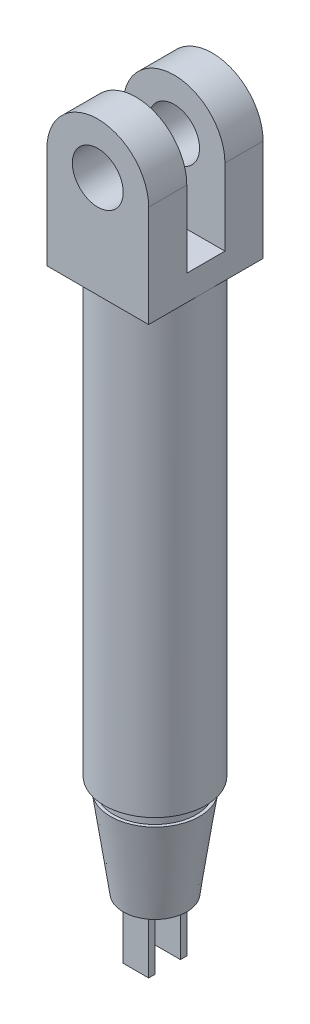
ISO-10303-21;
HEADER;
FILE_DESCRIPTION(('STEP AP214'),'2;1');
FILE_NAME('part.step','',(''),(''),'','','');
FILE_SCHEMA(('AUTOMOTIVE_DESIGN { 1 0 10303 214 1 1 1 1 }'));
ENDSEC;
DATA;
#1=APPLICATION_CONTEXT('core data for automotive mechanical design processes');
#2=APPLICATION_PROTOCOL_DEFINITION('international standard','automotive_design',2000,#1);
#3=PRODUCT_CONTEXT('',#1,'mechanical');
#4=PRODUCT('Part','Part','',(#3));
#5=PRODUCT_RELATED_PRODUCT_CATEGORY('part','',(#4));
#6=PRODUCT_DEFINITION_FORMATION('','',#4);
#7=PRODUCT_DEFINITION_CONTEXT('part definition',#1,'design');
#8=PRODUCT_DEFINITION('design','',#6,#7);
#9=PRODUCT_DEFINITION_SHAPE('','',#8);
#10=(LENGTH_UNIT() NAMED_UNIT(*) SI_UNIT(.MILLI.,.METRE.));
#11=(NAMED_UNIT(*) PLANE_ANGLE_UNIT() SI_UNIT($,.RADIAN.));
#12=(NAMED_UNIT(*) SI_UNIT($,.STERADIAN.) SOLID_ANGLE_UNIT());
#13=UNCERTAINTY_MEASURE_WITH_UNIT(LENGTH_MEASURE(1.E-05),#10,'distance_accuracy_value','');
#14=(GEOMETRIC_REPRESENTATION_CONTEXT(3) GLOBAL_UNCERTAINTY_ASSIGNED_CONTEXT((#13)) GLOBAL_UNIT_ASSIGNED_CONTEXT((#10,
#11,#12)) REPRESENTATION_CONTEXT('',''));
#15=CARTESIAN_POINT('',(0.,0.,0.));
#16=DIRECTION('',(0.,0.,1.));
#17=DIRECTION('',(1.,0.,0.));
#18=AXIS2_PLACEMENT_3D('',#15,#16,#17);
#19=CARTESIAN_POINT('',(0.,74.,0.));
#20=DIRECTION('',(0.,1.,0.));
#21=DIRECTION('',(0.,0.,1.));
#22=AXIS2_PLACEMENT_3D('',#19,#20,#21);
#23=PLANE('',#22);
#24=DIRECTION('',(1.,0.,0.));
#25=VECTOR('',#24,1.);
#26=CARTESIAN_POINT('',(-8.,74.,-3.));
#27=LINE('',#26,#25);
#28=CARTESIAN_POINT('',(-8.,74.,-3.));
#29=VERTEX_POINT('',#28);
#30=CARTESIAN_POINT('',(8.,74.,-3.));
#31=VERTEX_POINT('',#30);
#32=EDGE_CURVE('E228',#29,#31,#27,.T.);
#33=ORIENTED_EDGE('',*,*,#32,.F.);
#34=DIRECTION('',(0.,0.,1.));
#35=VECTOR('',#34,1.);
#36=CARTESIAN_POINT('',(-8.,74.,-9.));
#37=LINE('',#36,#35);
#38=CARTESIAN_POINT('',(-8.,74.,3.));
#39=VERTEX_POINT('',#38);
#40=EDGE_CURVE('E39',#29,#39,#37,.T.);
#41=ORIENTED_EDGE('',*,*,#40,.T.);
#42=DIRECTION('',(1.,0.,0.));
#43=VECTOR('',#42,1.);
#44=CARTESIAN_POINT('',(-8.,74.,3.));
#45=LINE('',#44,#43);
#46=CARTESIAN_POINT('',(8.,74.,3.));
#47=VERTEX_POINT('',#46);
#48=EDGE_CURVE('E253',#39,#47,#45,.T.);
#49=ORIENTED_EDGE('',*,*,#48,.T.);
#50=DIRECTION('',(0.,0.,-1.));
#51=VECTOR('',#50,1.);
#52=CARTESIAN_POINT('',(8.,74.,-9.));
#53=LINE('',#52,#51);
#54=EDGE_CURVE('E270',#47,#31,#53,.T.);
#55=ORIENTED_EDGE('',*,*,#54,.T.);
#56=EDGE_LOOP('',(#33,#41,#49,#55));
#57=FACE_BOUND('',#56,.T.);
#58=ADVANCED_FACE('F35',(#57),#23,.T.);
#59=CARTESIAN_POINT('',(0.,-16.,0.));
#60=DIRECTION('',(0.,1.,0.));
#61=DIRECTION('',(-1.,0.,0.));
#62=AXIS2_PLACEMENT_3D('',#59,#60,#61);
#63=PLANE('',#62);
#64=DIRECTION('',(0.,0.,1.));
#65=VECTOR('',#64,1.);
#66=CARTESIAN_POINT('',(2.,-16.,-3.));
#67=LINE('',#66,#65);
#68=CARTESIAN_POINT('',(2.,-16.,-3.));
#69=VERTEX_POINT('',#68);
#70=CARTESIAN_POINT('',(2.,-16.,-2.));
#71=VERTEX_POINT('',#70);
#72=EDGE_CURVE('E58',#69,#71,#67,.T.);
#73=ORIENTED_EDGE('',*,*,#72,.F.);
#74=DIRECTION('',(-1.,0.,0.));
#75=VECTOR('',#74,1.);
#76=CARTESIAN_POINT('',(-2.,-16.,-3.));
#77=LINE('',#76,#75);
#78=CARTESIAN_POINT('',(-2.,-16.,-3.));
#79=VERTEX_POINT('',#78);
#80=EDGE_CURVE('E53',#69,#79,#77,.T.);
#81=ORIENTED_EDGE('',*,*,#80,.T.);
#82=DIRECTION('',(0.,0.,1.));
#83=VECTOR('',#82,1.);
#84=CARTESIAN_POINT('',(-2.,-16.,-3.));
#85=LINE('',#84,#83);
#86=CARTESIAN_POINT('',(-2.,-16.,-2.));
#87=VERTEX_POINT('',#86);
#88=EDGE_CURVE('E190',#79,#87,#85,.T.);
#89=ORIENTED_EDGE('',*,*,#88,.T.);
#90=DIRECTION('',(-1.,0.,0.));
#91=VECTOR('',#90,1.);
#92=CARTESIAN_POINT('',(-2.,-16.,-2.));
#93=LINE('',#92,#91);
#94=EDGE_CURVE('E182',#71,#87,#93,.T.);
#95=ORIENTED_EDGE('',*,*,#94,.F.);
#96=EDGE_LOOP('',(#73,#81,#89,#95));
#97=FACE_BOUND('',#96,.T.);
#98=DIRECTION('',(0.,0.,-1.));
#99=VECTOR('',#98,1.);
#100=CARTESIAN_POINT('',(-2.,-16.,3.));
#101=LINE('',#100,#99);
#102=CARTESIAN_POINT('',(-2.,-16.,3.));
#103=VERTEX_POINT('',#102);
#104=CARTESIAN_POINT('',(-2.,-16.,2.));
#105=VERTEX_POINT('',#104);
#106=EDGE_CURVE('E205',#103,#105,#101,.T.);
#107=ORIENTED_EDGE('',*,*,#106,.F.);
#108=DIRECTION('',(-1.,0.,0.));
#109=VECTOR('',#108,1.);
#110=CARTESIAN_POINT('',(-2.,-16.,3.));
#111=LINE('',#110,#109);
#112=CARTESIAN_POINT('',(2.,-16.,3.));
#113=VERTEX_POINT('',#112);
#114=EDGE_CURVE('E202',#113,#103,#111,.T.);
#115=ORIENTED_EDGE('',*,*,#114,.F.);
#116=DIRECTION('',(0.,0.,-1.));
#117=VECTOR('',#116,1.);
#118=CARTESIAN_POINT('',(2.,-16.,3.));
#119=LINE('',#118,#117);
#120=CARTESIAN_POINT('',(2.,-16.,2.));
#121=VERTEX_POINT('',#120);
#122=EDGE_CURVE('E216',#113,#121,#119,.T.);
#123=ORIENTED_EDGE('',*,*,#122,.T.);
#124=DIRECTION('',(-1.,0.,0.));
#125=VECTOR('',#124,1.);
#126=CARTESIAN_POINT('',(-2.,-16.,2.));
#127=LINE('',#126,#125);
#128=EDGE_CURVE('E197',#121,#105,#127,.T.);
#129=ORIENTED_EDGE('',*,*,#128,.T.);
#130=EDGE_LOOP('',(#107,#115,#123,#129));
#131=FACE_BOUND('',#130,.T.);
#132=CARTESIAN_POINT('',(0.,-16.,0.));
#133=DIRECTION('',(0.,1.,0.));
#134=DIRECTION('',(-1.,0.,0.));
#135=AXIS2_PLACEMENT_3D('',#132,#133,#134);
#136=CIRCLE('',#135,5.);
#137=CARTESIAN_POINT('',(-5.,-16.,0.));
#138=VERTEX_POINT('',#137);
#139=EDGE_CURVE('E11',#138,#138,#136,.T.);
#140=ORIENTED_EDGE('',*,*,#139,.F.);
#141=EDGE_LOOP('',(#140));
#142=FACE_BOUND('',#141,.T.);
#143=ADVANCED_FACE('F37',(#97,#131,#142),#63,.F.);
#144=CARTESIAN_POINT('',(0.,-16.,0.));
#145=DIRECTION('',(0.,1.,0.));
#146=DIRECTION('',(-1.,0.,0.));
#147=AXIS2_PLACEMENT_3D('',#144,#145,#146);
#148=CONICAL_SURFACE('',#147,5.,0.141897054604164);
#149=CARTESIAN_POINT('',(0.,-2.,0.));
#150=DIRECTION('',(0.,1.,0.));
#151=DIRECTION('',(-1.,0.,0.));
#152=AXIS2_PLACEMENT_3D('',#149,#150,#151);
#153=CIRCLE('',#152,7.);
#154=CARTESIAN_POINT('',(-7.,-2.,0.));
#155=VERTEX_POINT('',#154);
#156=EDGE_CURVE('E45',#155,#155,#153,.T.);
#157=ORIENTED_EDGE('',*,*,#156,.F.);
#158=EDGE_LOOP('',(#157));
#159=FACE_BOUND('',#158,.T.);
#160=ORIENTED_EDGE('',*,*,#139,.T.);
#161=EDGE_LOOP('',(#160));
#162=FACE_BOUND('',#161,.T.);
#163=ADVANCED_FACE('F340',(#159,#162),#148,.T.);
#164=CARTESIAN_POINT('',(6.5,-2.,0.));
#165=DIRECTION('',(0.,-1.,0.));
#166=DIRECTION('',(1.,0.,0.));
#167=AXIS2_PLACEMENT_3D('',#164,#165,#166);
#168=PLANE('',#167);
#169=CARTESIAN_POINT('',(0.,-2.,0.));
#170=DIRECTION('',(0.,1.,0.));
#171=DIRECTION('',(-1.,0.,0.));
#172=AXIS2_PLACEMENT_3D('',#169,#170,#171);
#173=CIRCLE('',#172,6.5);
#174=CARTESIAN_POINT('',(-6.5,-2.,0.));
#175=VERTEX_POINT('',#174);
#176=EDGE_CURVE('E332',#175,#175,#173,.T.);
#177=ORIENTED_EDGE('',*,*,#176,.F.);
#178=EDGE_LOOP('',(#177));
#179=FACE_BOUND('',#178,.T.);
#180=ORIENTED_EDGE('',*,*,#156,.T.);
#181=EDGE_LOOP('',(#180));
#182=FACE_BOUND('',#181,.T.);
#183=ADVANCED_FACE('F338',(#179,#182),#168,.F.);
#184=CARTESIAN_POINT('',(0.,70.,0.));
#185=DIRECTION('',(0.,1.,0.));
#186=DIRECTION('',(-1.,0.,0.));
#187=AXIS2_PLACEMENT_3D('',#184,#185,#186);
#188=CYLINDRICAL_SURFACE('',#187,6.5);
#189=CARTESIAN_POINT('',(0.,0.,0.));
#190=DIRECTION('',(0.,1.,0.));
#191=DIRECTION('',(-1.,0.,0.));
#192=AXIS2_PLACEMENT_3D('',#189,#190,#191);
#193=CIRCLE('',#192,6.5);
#194=CARTESIAN_POINT('',(-6.5,0.,0.));
#195=VERTEX_POINT('',#194);
#196=EDGE_CURVE('E329',#195,#195,#193,.T.);
#197=ORIENTED_EDGE('',*,*,#196,.F.);
#198=EDGE_LOOP('',(#197));
#199=FACE_BOUND('',#198,.T.);
#200=ORIENTED_EDGE('',*,*,#176,.T.);
#201=EDGE_LOOP('',(#200));
#202=FACE_BOUND('',#201,.T.);
#203=ADVANCED_FACE('F429',(#199,#202),#188,.T.);
#204=CARTESIAN_POINT('',(8.,0.,0.));
#205=DIRECTION('',(0.,1.,0.));
#206=DIRECTION('',(-1.,0.,0.));
#207=AXIS2_PLACEMENT_3D('',#204,#205,#206);
#208=PLANE('',#207);
#209=CARTESIAN_POINT('',(0.,0.,0.));
#210=DIRECTION('',(0.,1.,0.));
#211=DIRECTION('',(-1.,0.,0.));
#212=AXIS2_PLACEMENT_3D('',#209,#210,#211);
#213=CIRCLE('',#212,8.);
#214=CARTESIAN_POINT('',(-8.,0.,0.));
#215=VERTEX_POINT('',#214);
#216=EDGE_CURVE('E326',#215,#215,#213,.T.);
#217=ORIENTED_EDGE('',*,*,#216,.F.);
#218=EDGE_LOOP('',(#217));
#219=FACE_BOUND('',#218,.T.);
#220=ORIENTED_EDGE('',*,*,#196,.T.);
#221=EDGE_LOOP('',(#220));
#222=FACE_BOUND('',#221,.T.);
#223=ADVANCED_FACE('F425',(#219,#222),#208,.F.);
#224=CARTESIAN_POINT('',(0.,70.,0.));
#225=DIRECTION('',(0.,1.,0.));
#226=DIRECTION('',(-1.,0.,0.));
#227=AXIS2_PLACEMENT_3D('',#224,#225,#226);
#228=CYLINDRICAL_SURFACE('',#227,7.99999999999999);
#229=CARTESIAN_POINT('',(0.,70.,0.));
#230=DIRECTION('',(0.,1.,0.));
#231=DIRECTION('',(-1.,0.,0.));
#232=AXIS2_PLACEMENT_3D('',#229,#230,#231);
#233=CIRCLE('',#232,7.99999999999998);
#234=CARTESIAN_POINT('',(-8.,70.,0.));
#235=VERTEX_POINT('',#234);
#236=CARTESIAN_POINT('',(8.,70.,0.));
#237=VERTEX_POINT('',#236);
#238=EDGE_CURVE('E323',#235,#237,#233,.T.);
#239=ORIENTED_EDGE('',*,*,#238,.F.);
#240=EDGE_CURVE('E322',#237,#235,#233,.T.);
#241=ORIENTED_EDGE('',*,*,#240,.F.);
#242=EDGE_LOOP('',(#239,#241));
#243=FACE_BOUND('',#242,.T.);
#244=ORIENTED_EDGE('',*,*,#216,.T.);
#245=EDGE_LOOP('',(#244));
#246=FACE_BOUND('',#245,.T.);
#247=ADVANCED_FACE('F411',(#243,#246),#228,.T.);
#248=CARTESIAN_POINT('',(0.,70.,0.));
#249=DIRECTION('',(0.,1.,0.));
#250=DIRECTION('',(0.,0.,1.));
#251=AXIS2_PLACEMENT_3D('',#248,#249,#250);
#252=PLANE('',#251);
#253=DIRECTION('',(0.,0.,1.));
#254=VECTOR('',#253,1.);
#255=CARTESIAN_POINT('',(-8.,70.,-9.));
#256=LINE('',#255,#254);
#257=CARTESIAN_POINT('',(-8.,70.,9.));
#258=VERTEX_POINT('',#257);
#259=EDGE_CURVE('E310',#235,#258,#256,.T.);
#260=ORIENTED_EDGE('',*,*,#259,.F.);
#261=ORIENTED_EDGE('',*,*,#238,.T.);
#262=DIRECTION('',(0.,0.,-1.));
#263=VECTOR('',#262,1.);
#264=CARTESIAN_POINT('',(8.,70.,-9.));
#265=LINE('',#264,#263);
#266=CARTESIAN_POINT('',(8.,70.,9.));
#267=VERTEX_POINT('',#266);
#268=EDGE_CURVE('E647',#267,#237,#265,.T.);
#269=ORIENTED_EDGE('',*,*,#268,.F.);
#270=DIRECTION('',(1.,0.,0.));
#271=VECTOR('',#270,1.);
#272=CARTESIAN_POINT('',(-8.,70.,9.));
#273=LINE('',#272,#271);
#274=EDGE_CURVE('E303',#258,#267,#273,.T.);
#275=ORIENTED_EDGE('',*,*,#274,.F.);
#276=EDGE_LOOP('',(#260,#261,#269,#275));
#277=FACE_BOUND('',#276,.T.);
#278=ADVANCED_FACE('F407',(#277),#252,.F.);
#279=CARTESIAN_POINT('',(8.,70.,-9.));
#280=VERTEX_POINT('',#279);
#281=EDGE_CURVE('E643',#237,#280,#265,.T.);
#282=ORIENTED_EDGE('',*,*,#281,.F.);
#283=ORIENTED_EDGE('',*,*,#240,.T.);
#284=CARTESIAN_POINT('',(-8.,70.,-9.));
#285=VERTEX_POINT('',#284);
#286=EDGE_CURVE('E305',#285,#235,#256,.T.);
#287=ORIENTED_EDGE('',*,*,#286,.F.);
#288=DIRECTION('',(-1.,0.,0.));
#289=VECTOR('',#288,1.);
#290=CARTESIAN_POINT('',(-8.,70.,-9.));
#291=LINE('',#290,#289);
#292=EDGE_CURVE('E646',#280,#285,#291,.T.);
#293=ORIENTED_EDGE('',*,*,#292,.F.);
#294=EDGE_LOOP('',(#282,#283,#287,#293));
#295=FACE_BOUND('',#294,.T.);
#296=ADVANCED_FACE('F410',(#295),#252,.F.);
#297=CARTESIAN_POINT('',(8.,74.,-9.));
#298=DIRECTION('',(-1.,0.,0.));
#299=DIRECTION('',(0.,0.,1.));
#300=AXIS2_PLACEMENT_3D('',#297,#298,#299);
#301=PLANE('',#300);
#302=ORIENTED_EDGE('',*,*,#268,.T.);
#303=ORIENTED_EDGE('',*,*,#281,.T.);
#304=DIRECTION('',(0.,-1.,0.));
#305=VECTOR('',#304,1.);
#306=CARTESIAN_POINT('',(8.,74.,-9.));
#307=LINE('',#306,#305);
#308=CARTESIAN_POINT('',(8.,86.,-9.));
#309=VERTEX_POINT('',#308);
#310=EDGE_CURVE('E319',#309,#280,#307,.T.);
#311=ORIENTED_EDGE('',*,*,#310,.F.);
#312=DIRECTION('',(0.,0.,1.));
#313=VECTOR('',#312,1.);
#314=CARTESIAN_POINT('',(8.,86.,-9.));
#315=LINE('',#314,#313);
#316=CARTESIAN_POINT('',(8.,86.,-3.));
#317=VERTEX_POINT('',#316);
#318=EDGE_CURVE('E234',#309,#317,#315,.T.);
#319=ORIENTED_EDGE('',*,*,#318,.T.);
#320=DIRECTION('',(0.,1.,0.));
#321=VECTOR('',#320,1.);
#322=CARTESIAN_POINT('',(8.,86.,-3.));
#323=LINE('',#322,#321);
#324=EDGE_CURVE('E235',#31,#317,#323,.T.);
#325=ORIENTED_EDGE('',*,*,#324,.F.);
#326=ORIENTED_EDGE('',*,*,#54,.F.);
#327=DIRECTION('',(0.,1.,0.));
#328=VECTOR('',#327,1.);
#329=CARTESIAN_POINT('',(8.,86.,3.));
#330=LINE('',#329,#328);
#331=CARTESIAN_POINT('',(8.,86.,3.));
#332=VERTEX_POINT('',#331);
#333=EDGE_CURVE('E269',#47,#332,#330,.T.);
#334=ORIENTED_EDGE('',*,*,#333,.T.);
#335=DIRECTION('',(0.,0.,-1.));
#336=VECTOR('',#335,1.);
#337=CARTESIAN_POINT('',(8.,86.,9.));
#338=LINE('',#337,#336);
#339=CARTESIAN_POINT('',(8.,86.,9.));
#340=VERTEX_POINT('',#339);
#341=EDGE_CURVE('E288',#340,#332,#338,.T.);
#342=ORIENTED_EDGE('',*,*,#341,.F.);
#343=DIRECTION('',(0.,-1.,0.));
#344=VECTOR('',#343,1.);
#345=CARTESIAN_POINT('',(8.,74.,9.));
#346=LINE('',#345,#344);
#347=EDGE_CURVE('E304',#340,#267,#346,.T.);
#348=ORIENTED_EDGE('',*,*,#347,.T.);
#349=EDGE_LOOP('',(#302,#303,#311,#319,#325,#326,#334,#342,#348));
#350=FACE_BOUND('',#349,.T.);
#351=ADVANCED_FACE('F302',(#350),#301,.F.);
#352=CARTESIAN_POINT('',(-8.,74.,-9.));
#353=DIRECTION('',(0.,0.,1.));
#354=DIRECTION('',(1.,0.,0.));
#355=AXIS2_PLACEMENT_3D('',#352,#353,#354);
#356=PLANE('',#355);
#357=ORIENTED_EDGE('',*,*,#292,.T.);
#358=DIRECTION('',(0.,-1.,0.));
#359=VECTOR('',#358,1.);
#360=CARTESIAN_POINT('',(-8.,74.,-9.));
#361=LINE('',#360,#359);
#362=CARTESIAN_POINT('',(-8.,86.,-9.));
#363=VERTEX_POINT('',#362);
#364=EDGE_CURVE('E316',#363,#285,#361,.T.);
#365=ORIENTED_EDGE('',*,*,#364,.F.);
#366=CARTESIAN_POINT('',(0.,86.,-9.));
#367=DIRECTION('',(0.,0.,1.));
#368=DIRECTION('',(-1.,0.,0.));
#369=AXIS2_PLACEMENT_3D('',#366,#367,#368);
#370=CIRCLE('',#369,8.);
#371=EDGE_CURVE('E231',#309,#363,#370,.T.);
#372=ORIENTED_EDGE('',*,*,#371,.F.);
#373=ORIENTED_EDGE('',*,*,#310,.T.);
#374=EDGE_LOOP('',(#357,#365,#372,#373));
#375=FACE_BOUND('',#374,.T.);
#376=CARTESIAN_POINT('',(0.,86.,-9.));
#377=DIRECTION('',(0.,0.,1.));
#378=DIRECTION('',(1.,0.,0.));
#379=AXIS2_PLACEMENT_3D('',#376,#377,#378);
#380=CIRCLE('',#379,4.);
#381=CARTESIAN_POINT('',(4.,86.,-9.));
#382=VERTEX_POINT('',#381);
#383=EDGE_CURVE('E225',#382,#382,#380,.T.);
#384=ORIENTED_EDGE('',*,*,#383,.T.);
#385=EDGE_LOOP('',(#384));
#386=FACE_BOUND('',#385,.T.);
#387=ADVANCED_FACE('F417',(#375,#386),#356,.F.);
#388=CARTESIAN_POINT('',(-8.,74.,-9.));
#389=DIRECTION('',(1.,0.,0.));
#390=DIRECTION('',(0.,0.,-1.));
#391=AXIS2_PLACEMENT_3D('',#388,#389,#390);
#392=PLANE('',#391);
#393=ORIENTED_EDGE('',*,*,#286,.T.);
#394=ORIENTED_EDGE('',*,*,#259,.T.);
#395=DIRECTION('',(0.,-1.,0.));
#396=VECTOR('',#395,1.);
#397=CARTESIAN_POINT('',(-8.,74.,9.));
#398=LINE('',#397,#396);
#399=CARTESIAN_POINT('',(-8.,86.,9.));
#400=VERTEX_POINT('',#399);
#401=EDGE_CURVE('E293',#400,#258,#398,.T.);
#402=ORIENTED_EDGE('',*,*,#401,.F.);
#403=DIRECTION('',(0.,0.,-1.));
#404=VECTOR('',#403,1.);
#405=CARTESIAN_POINT('',(-8.,86.,9.));
#406=LINE('',#405,#404);
#407=CARTESIAN_POINT('',(-8.,86.,3.));
#408=VERTEX_POINT('',#407);
#409=EDGE_CURVE('E259',#400,#408,#406,.T.);
#410=ORIENTED_EDGE('',*,*,#409,.T.);
#411=DIRECTION('',(0.,-1.,0.));
#412=VECTOR('',#411,1.);
#413=CARTESIAN_POINT('',(-8.,74.,3.));
#414=LINE('',#413,#412);
#415=EDGE_CURVE('E260',#408,#39,#414,.T.);
#416=ORIENTED_EDGE('',*,*,#415,.T.);
#417=ORIENTED_EDGE('',*,*,#40,.F.);
#418=DIRECTION('',(0.,-1.,0.));
#419=VECTOR('',#418,1.);
#420=CARTESIAN_POINT('',(-8.,74.,-3.));
#421=LINE('',#420,#419);
#422=CARTESIAN_POINT('',(-8.,86.,-3.));
#423=VERTEX_POINT('',#422);
#424=EDGE_CURVE('E238',#423,#29,#421,.T.);
#425=ORIENTED_EDGE('',*,*,#424,.F.);
#426=DIRECTION('',(0.,0.,1.));
#427=VECTOR('',#426,1.);
#428=CARTESIAN_POINT('',(-8.,86.,-9.));
#429=LINE('',#428,#427);
#430=EDGE_CURVE('E247',#363,#423,#429,.T.);
#431=ORIENTED_EDGE('',*,*,#430,.F.);
#432=ORIENTED_EDGE('',*,*,#364,.T.);
#433=EDGE_LOOP('',(#393,#394,#402,#410,#416,#417,#425,#431,#432));
#434=FACE_BOUND('',#433,.T.);
#435=ADVANCED_FACE('F291',(#434),#392,.F.);
#436=CARTESIAN_POINT('',(-8.,74.,9.));
#437=DIRECTION('',(0.,0.,-1.));
#438=DIRECTION('',(-1.,0.,0.));
#439=AXIS2_PLACEMENT_3D('',#436,#437,#438);
#440=PLANE('',#439);
#441=ORIENTED_EDGE('',*,*,#274,.T.);
#442=ORIENTED_EDGE('',*,*,#347,.F.);
#443=CARTESIAN_POINT('',(0.,86.,9.));
#444=DIRECTION('',(0.,0.,1.));
#445=DIRECTION('',(-1.,0.,0.));
#446=AXIS2_PLACEMENT_3D('',#443,#444,#445);
#447=CIRCLE('',#446,8.);
#448=EDGE_CURVE('E256',#340,#400,#447,.T.);
#449=ORIENTED_EDGE('',*,*,#448,.T.);
#450=ORIENTED_EDGE('',*,*,#401,.T.);
#451=EDGE_LOOP('',(#441,#442,#449,#450));
#452=FACE_BOUND('',#451,.T.);
#453=CARTESIAN_POINT('',(0.,86.,9.));
#454=DIRECTION('',(0.,0.,1.));
#455=DIRECTION('',(1.,0.,0.));
#456=AXIS2_PLACEMENT_3D('',#453,#454,#455);
#457=CIRCLE('',#456,4.);
#458=CARTESIAN_POINT('',(4.,86.,9.));
#459=VERTEX_POINT('',#458);
#460=EDGE_CURVE('E250',#459,#459,#457,.T.);
#461=ORIENTED_EDGE('',*,*,#460,.F.);
#462=EDGE_LOOP('',(#461));
#463=FACE_BOUND('',#462,.T.);
#464=ADVANCED_FACE('F404',(#452,#463),#440,.F.);
#465=CARTESIAN_POINT('',(0.,86.,3.));
#466=DIRECTION('',(0.,0.,-1.));
#467=DIRECTION('',(-1.,0.,0.));
#468=AXIS2_PLACEMENT_3D('',#465,#466,#467);
#469=PLANE('',#468);
#470=ORIENTED_EDGE('',*,*,#48,.F.);
#471=ORIENTED_EDGE('',*,*,#415,.F.);
#472=CARTESIAN_POINT('',(0.,86.,3.));
#473=DIRECTION('',(0.,0.,1.));
#474=DIRECTION('',(-1.,0.,0.));
#475=AXIS2_PLACEMENT_3D('',#472,#473,#474);
#476=CIRCLE('',#475,8.);
#477=EDGE_CURVE('E263',#332,#408,#476,.T.);
#478=ORIENTED_EDGE('',*,*,#477,.F.);
#479=ORIENTED_EDGE('',*,*,#333,.F.);
#480=EDGE_LOOP('',(#470,#471,#478,#479));
#481=FACE_BOUND('',#480,.T.);
#482=CARTESIAN_POINT('',(0.,86.,3.));
#483=DIRECTION('',(0.,0.,1.));
#484=DIRECTION('',(1.,0.,0.));
#485=AXIS2_PLACEMENT_3D('',#482,#483,#484);
#486=CIRCLE('',#485,4.);
#487=CARTESIAN_POINT('',(4.,86.,3.));
#488=VERTEX_POINT('',#487);
#489=EDGE_CURVE('E249',#488,#488,#486,.T.);
#490=ORIENTED_EDGE('',*,*,#489,.T.);
#491=EDGE_LOOP('',(#490));
#492=FACE_BOUND('',#491,.T.);
#493=ADVANCED_FACE('F294',(#481,#492),#469,.T.);
#494=CARTESIAN_POINT('',(0.,86.,9.));
#495=DIRECTION('',(0.,0.,-1.));
#496=DIRECTION('',(-1.,0.,0.));
#497=AXIS2_PLACEMENT_3D('',#494,#495,#496);
#498=CYLINDRICAL_SURFACE('',#497,8.);
#499=ORIENTED_EDGE('',*,*,#477,.T.);
#500=ORIENTED_EDGE('',*,*,#409,.F.);
#501=ORIENTED_EDGE('',*,*,#448,.F.);
#502=ORIENTED_EDGE('',*,*,#341,.T.);
#503=EDGE_LOOP('',(#499,#500,#501,#502));
#504=FACE_BOUND('',#503,.T.);
#505=ADVANCED_FACE('F285',(#504),#498,.T.);
#506=CARTESIAN_POINT('',(0.,86.,9.));
#507=DIRECTION('',(0.,0.,-1.));
#508=DIRECTION('',(-1.,0.,0.));
#509=AXIS2_PLACEMENT_3D('',#506,#507,#508);
#510=CYLINDRICAL_SURFACE('',#509,4.);
#511=ORIENTED_EDGE('',*,*,#460,.T.);
#512=EDGE_LOOP('',(#511));
#513=FACE_BOUND('',#512,.T.);
#514=ORIENTED_EDGE('',*,*,#489,.F.);
#515=EDGE_LOOP('',(#514));
#516=FACE_BOUND('',#515,.T.);
#517=ADVANCED_FACE('F397',(#513,#516),#510,.F.);
#518=CARTESIAN_POINT('',(0.,86.,-9.));
#519=DIRECTION('',(0.,0.,1.));
#520=DIRECTION('',(1.,0.,0.));
#521=AXIS2_PLACEMENT_3D('',#518,#519,#520);
#522=CYLINDRICAL_SURFACE('',#521,8.);
#523=CARTESIAN_POINT('',(0.,86.,-3.));
#524=DIRECTION('',(0.,0.,1.));
#525=DIRECTION('',(-1.,0.,0.));
#526=AXIS2_PLACEMENT_3D('',#523,#524,#525);
#527=CIRCLE('',#526,8.);
#528=EDGE_CURVE('E241',#317,#423,#527,.T.);
#529=ORIENTED_EDGE('',*,*,#528,.F.);
#530=ORIENTED_EDGE('',*,*,#318,.F.);
#531=ORIENTED_EDGE('',*,*,#371,.T.);
#532=ORIENTED_EDGE('',*,*,#430,.T.);
#533=EDGE_LOOP('',(#529,#530,#531,#532));
#534=FACE_BOUND('',#533,.T.);
#535=ADVANCED_FACE('F393',(#534),#522,.T.);
#536=CARTESIAN_POINT('',(0.,86.,-3.));
#537=DIRECTION('',(0.,0.,1.));
#538=DIRECTION('',(-1.,0.,0.));
#539=AXIS2_PLACEMENT_3D('',#536,#537,#538);
#540=PLANE('',#539);
#541=CARTESIAN_POINT('',(0.,86.,-3.));
#542=DIRECTION('',(0.,0.,1.));
#543=DIRECTION('',(1.,0.,0.));
#544=AXIS2_PLACEMENT_3D('',#541,#542,#543);
#545=CIRCLE('',#544,4.);
#546=CARTESIAN_POINT('',(4.,86.,-3.));
#547=VERTEX_POINT('',#546);
#548=EDGE_CURVE('E224',#547,#547,#545,.T.);
#549=ORIENTED_EDGE('',*,*,#548,.F.);
#550=EDGE_LOOP('',(#549));
#551=FACE_BOUND('',#550,.T.);
#552=ORIENTED_EDGE('',*,*,#32,.T.);
#553=ORIENTED_EDGE('',*,*,#324,.T.);
#554=ORIENTED_EDGE('',*,*,#528,.T.);
#555=ORIENTED_EDGE('',*,*,#424,.T.);
#556=EDGE_LOOP('',(#552,#553,#554,#555));
#557=FACE_BOUND('',#556,.T.);
#558=ADVANCED_FACE('F389',(#551,#557),#540,.T.);
#559=CARTESIAN_POINT('',(0.,86.,-9.));
#560=DIRECTION('',(0.,0.,1.));
#561=DIRECTION('',(1.,0.,0.));
#562=AXIS2_PLACEMENT_3D('',#559,#560,#561);
#563=CYLINDRICAL_SURFACE('',#562,4.);
#564=ORIENTED_EDGE('',*,*,#383,.F.);
#565=EDGE_LOOP('',(#564));
#566=FACE_BOUND('',#565,.T.);
#567=ORIENTED_EDGE('',*,*,#548,.T.);
#568=EDGE_LOOP('',(#567));
#569=FACE_BOUND('',#568,.T.);
#570=ADVANCED_FACE('F386',(#566,#569),#563,.F.);
#571=CARTESIAN_POINT('',(-2.,-16.,3.));
#572=DIRECTION('',(1.,0.,0.));
#573=DIRECTION('',(0.,1.,0.));
#574=AXIS2_PLACEMENT_3D('',#571,#572,#573);
#575=PLANE('',#574);
#576=DIRECTION('',(0.,-1.,0.));
#577=VECTOR('',#576,1.);
#578=CARTESIAN_POINT('',(-2.,-16.,2.));
#579=LINE('',#578,#577);
#580=CARTESIAN_POINT('',(-2.,-25.,2.));
#581=VERTEX_POINT('',#580);
#582=EDGE_CURVE('E192',#105,#581,#579,.T.);
#583=ORIENTED_EDGE('',*,*,#582,.T.);
#584=DIRECTION('',(0.,0.,-1.));
#585=VECTOR('',#584,1.);
#586=CARTESIAN_POINT('',(-2.,-25.,3.));
#587=LINE('',#586,#585);
#588=CARTESIAN_POINT('',(-2.,-25.,3.));
#589=VERTEX_POINT('',#588);
#590=EDGE_CURVE('E221',#589,#581,#587,.T.);
#591=ORIENTED_EDGE('',*,*,#590,.F.);
#592=DIRECTION('',(0.,-1.,0.));
#593=VECTOR('',#592,1.);
#594=CARTESIAN_POINT('',(-2.,-16.,3.));
#595=LINE('',#594,#593);
#596=EDGE_CURVE('E193',#103,#589,#595,.T.);
#597=ORIENTED_EDGE('',*,*,#596,.F.);
#598=ORIENTED_EDGE('',*,*,#106,.T.);
#599=EDGE_LOOP('',(#583,#591,#597,#598));
#600=FACE_BOUND('',#599,.T.);
#601=ADVANCED_FACE('F360',(#600),#575,.F.);
#602=CARTESIAN_POINT('',(-2.,-25.,3.));
#603=DIRECTION('',(0.,1.,0.));
#604=DIRECTION('',(0.,0.,1.));
#605=AXIS2_PLACEMENT_3D('',#602,#603,#604);
#606=PLANE('',#605);
#607=DIRECTION('',(1.,0.,0.));
#608=VECTOR('',#607,1.);
#609=CARTESIAN_POINT('',(-2.,-25.,2.));
#610=LINE('',#609,#608);
#611=CARTESIAN_POINT('',(2.,-25.,2.));
#612=VERTEX_POINT('',#611);
#613=EDGE_CURVE('E208',#581,#612,#610,.T.);
#614=ORIENTED_EDGE('',*,*,#613,.T.);
#615=DIRECTION('',(0.,0.,-1.));
#616=VECTOR('',#615,1.);
#617=CARTESIAN_POINT('',(2.,-25.,3.));
#618=LINE('',#617,#616);
#619=CARTESIAN_POINT('',(2.,-25.,3.));
#620=VERTEX_POINT('',#619);
#621=EDGE_CURVE('E218',#620,#612,#618,.T.);
#622=ORIENTED_EDGE('',*,*,#621,.F.);
#623=DIRECTION('',(1.,0.,0.));
#624=VECTOR('',#623,1.);
#625=CARTESIAN_POINT('',(-2.,-25.,3.));
#626=LINE('',#625,#624);
#627=EDGE_CURVE('E196',#589,#620,#626,.T.);
#628=ORIENTED_EDGE('',*,*,#627,.F.);
#629=ORIENTED_EDGE('',*,*,#590,.T.);
#630=EDGE_LOOP('',(#614,#622,#628,#629));
#631=FACE_BOUND('',#630,.T.);
#632=ADVANCED_FACE('F362',(#631),#606,.F.);
#633=CARTESIAN_POINT('',(2.,-16.,3.));
#634=DIRECTION('',(-1.,0.,0.));
#635=DIRECTION('',(0.,-1.,0.));
#636=AXIS2_PLACEMENT_3D('',#633,#634,#635);
#637=PLANE('',#636);
#638=DIRECTION('',(0.,1.,0.));
#639=VECTOR('',#638,1.);
#640=CARTESIAN_POINT('',(2.,-16.,2.));
#641=LINE('',#640,#639);
#642=EDGE_CURVE('E210',#612,#121,#641,.T.);
#643=ORIENTED_EDGE('',*,*,#642,.T.);
#644=ORIENTED_EDGE('',*,*,#122,.F.);
#645=DIRECTION('',(0.,1.,0.));
#646=VECTOR('',#645,1.);
#647=CARTESIAN_POINT('',(2.,-16.,3.));
#648=LINE('',#647,#646);
#649=EDGE_CURVE('E199',#620,#113,#648,.T.);
#650=ORIENTED_EDGE('',*,*,#649,.F.);
#651=ORIENTED_EDGE('',*,*,#621,.T.);
#652=EDGE_LOOP('',(#643,#644,#650,#651));
#653=FACE_BOUND('',#652,.T.);
#654=ADVANCED_FACE('F366',(#653),#637,.F.);
#655=CARTESIAN_POINT('',(0.,0.,3.));
#656=DIRECTION('',(0.,0.,1.));
#657=DIRECTION('',(1.,0.,0.));
#658=AXIS2_PLACEMENT_3D('',#655,#656,#657);
#659=PLANE('',#658);
#660=ORIENTED_EDGE('',*,*,#596,.T.);
#661=ORIENTED_EDGE('',*,*,#627,.T.);
#662=ORIENTED_EDGE('',*,*,#649,.T.);
#663=ORIENTED_EDGE('',*,*,#114,.T.);
#664=EDGE_LOOP('',(#660,#661,#662,#663));
#665=FACE_BOUND('',#664,.T.);
#666=ADVANCED_FACE('F356',(#665),#659,.T.);
#667=CARTESIAN_POINT('',(0.,0.,2.));
#668=DIRECTION('',(0.,0.,1.));
#669=DIRECTION('',(1.,0.,0.));
#670=AXIS2_PLACEMENT_3D('',#667,#668,#669);
#671=PLANE('',#670);
#672=ORIENTED_EDGE('',*,*,#582,.F.);
#673=ORIENTED_EDGE('',*,*,#128,.F.);
#674=ORIENTED_EDGE('',*,*,#642,.F.);
#675=ORIENTED_EDGE('',*,*,#613,.F.);
#676=EDGE_LOOP('',(#672,#673,#674,#675));
#677=FACE_BOUND('',#676,.T.);
#678=ADVANCED_FACE('F368',(#677),#671,.F.);
#679=CARTESIAN_POINT('',(-2.,-16.,-3.));
#680=DIRECTION('',(-1.,0.,0.));
#681=DIRECTION('',(0.,-1.,0.));
#682=AXIS2_PLACEMENT_3D('',#679,#680,#681);
#683=PLANE('',#682);
#684=DIRECTION('',(0.,-1.,0.));
#685=VECTOR('',#684,1.);
#686=CARTESIAN_POINT('',(-2.,-16.,-2.));
#687=LINE('',#686,#685);
#688=CARTESIAN_POINT('',(-2.,-25.,-2.));
#689=VERTEX_POINT('',#688);
#690=EDGE_CURVE('E179',#87,#689,#687,.T.);
#691=ORIENTED_EDGE('',*,*,#690,.F.);
#692=ORIENTED_EDGE('',*,*,#88,.F.);
#693=DIRECTION('',(0.,-1.,0.));
#694=VECTOR('',#693,1.);
#695=CARTESIAN_POINT('',(-2.,-16.,-3.));
#696=LINE('',#695,#694);
#697=CARTESIAN_POINT('',(-2.,-25.,-3.));
#698=VERTEX_POINT('',#697);
#699=EDGE_CURVE('E187',#79,#698,#696,.T.);
#700=ORIENTED_EDGE('',*,*,#699,.T.);
#701=DIRECTION('',(0.,0.,1.));
#702=VECTOR('',#701,1.);
#703=CARTESIAN_POINT('',(-2.,-25.,-3.));
#704=LINE('',#703,#702);
#705=EDGE_CURVE('E165',#698,#689,#704,.T.);
#706=ORIENTED_EDGE('',*,*,#705,.T.);
#707=EDGE_LOOP('',(#691,#692,#700,#706));
#708=FACE_BOUND('',#707,.T.);
#709=ADVANCED_FACE('F370',(#708),#683,.T.);
#710=CARTESIAN_POINT('',(2.,-16.,-3.));
#711=DIRECTION('',(1.,0.,0.));
#712=DIRECTION('',(0.,1.,0.));
#713=AXIS2_PLACEMENT_3D('',#710,#711,#712);
#714=PLANE('',#713);
#715=DIRECTION('',(0.,1.,0.));
#716=VECTOR('',#715,1.);
#717=CARTESIAN_POINT('',(2.,-16.,-2.));
#718=LINE('',#717,#716);
#719=CARTESIAN_POINT('',(2.,-25.,-2.));
#720=VERTEX_POINT('',#719);
#721=EDGE_CURVE('E160',#720,#71,#718,.T.);
#722=ORIENTED_EDGE('',*,*,#721,.F.);
#723=DIRECTION('',(0.,0.,1.));
#724=VECTOR('',#723,1.);
#725=CARTESIAN_POINT('',(2.,-25.,-3.));
#726=LINE('',#725,#724);
#727=CARTESIAN_POINT('',(2.,-25.,-3.));
#728=VERTEX_POINT('',#727);
#729=EDGE_CURVE('E155',#728,#720,#726,.T.);
#730=ORIENTED_EDGE('',*,*,#729,.F.);
#731=DIRECTION('',(0.,1.,0.));
#732=VECTOR('',#731,1.);
#733=CARTESIAN_POINT('',(2.,-16.,-3.));
#734=LINE('',#733,#732);
#735=EDGE_CURVE('E158',#728,#69,#734,.T.);
#736=ORIENTED_EDGE('',*,*,#735,.T.);
#737=ORIENTED_EDGE('',*,*,#72,.T.);
#738=EDGE_LOOP('',(#722,#730,#736,#737));
#739=FACE_BOUND('',#738,.T.);
#740=ADVANCED_FACE('F157',(#739),#714,.T.);
#741=CARTESIAN_POINT('',(-2.,-25.,-3.));
#742=DIRECTION('',(0.,-1.,0.));
#743=DIRECTION('',(0.,0.,-1.));
#744=AXIS2_PLACEMENT_3D('',#741,#742,#743);
#745=PLANE('',#744);
#746=DIRECTION('',(1.,0.,0.));
#747=VECTOR('',#746,1.);
#748=CARTESIAN_POINT('',(-2.,-25.,-2.));
#749=LINE('',#748,#747);
#750=EDGE_CURVE('E186',#689,#720,#749,.T.);
#751=ORIENTED_EDGE('',*,*,#750,.F.);
#752=ORIENTED_EDGE('',*,*,#705,.F.);
#753=DIRECTION('',(1.,0.,0.));
#754=VECTOR('',#753,1.);
#755=CARTESIAN_POINT('',(-2.,-25.,-3.));
#756=LINE('',#755,#754);
#757=EDGE_CURVE('E171',#698,#728,#756,.T.);
#758=ORIENTED_EDGE('',*,*,#757,.T.);
#759=ORIENTED_EDGE('',*,*,#729,.T.);
#760=EDGE_LOOP('',(#751,#752,#758,#759));
#761=FACE_BOUND('',#760,.T.);
#762=ADVANCED_FACE('F173',(#761),#745,.T.);
#763=CARTESIAN_POINT('',(0.,0.,-3.));
#764=DIRECTION('',(0.,0.,-1.));
#765=DIRECTION('',(1.,0.,0.));
#766=AXIS2_PLACEMENT_3D('',#763,#764,#765);
#767=PLANE('',#766);
#768=ORIENTED_EDGE('',*,*,#699,.F.);
#769=ORIENTED_EDGE('',*,*,#80,.F.);
#770=ORIENTED_EDGE('',*,*,#735,.F.);
#771=ORIENTED_EDGE('',*,*,#757,.F.);
#772=EDGE_LOOP('',(#768,#769,#770,#771));
#773=FACE_BOUND('',#772,.T.);
#774=ADVANCED_FACE('F170',(#773),#767,.T.);
#775=CARTESIAN_POINT('',(0.,0.,-2.));
#776=DIRECTION('',(0.,0.,-1.));
#777=DIRECTION('',(1.,0.,0.));
#778=AXIS2_PLACEMENT_3D('',#775,#776,#777);
#779=PLANE('',#778);
#780=ORIENTED_EDGE('',*,*,#690,.T.);
#781=ORIENTED_EDGE('',*,*,#750,.T.);
#782=ORIENTED_EDGE('',*,*,#721,.T.);
#783=ORIENTED_EDGE('',*,*,#94,.T.);
#784=EDGE_LOOP('',(#780,#781,#782,#783));
#785=FACE_BOUND('',#784,.T.);
#786=ADVANCED_FACE('F561',(#785),#779,.F.);
#787=CLOSED_SHELL('',(#58,#143,#163,#183,#203,#223,#247,#278,#296,#351,#387,#435,#464,#493,#505,
#517,#535,#558,#570,#601,#632,#654,#666,#678,#709,#740,#762,#774,#786));
#788=MANIFOLD_SOLID_BREP('B2',#787);
#789=ADVANCED_BREP_SHAPE_REPRESENTATION('',(#18,#788),#14);
#790=SHAPE_DEFINITION_REPRESENTATION(#9,#789);
ENDSEC;
END-ISO-10303-21;
